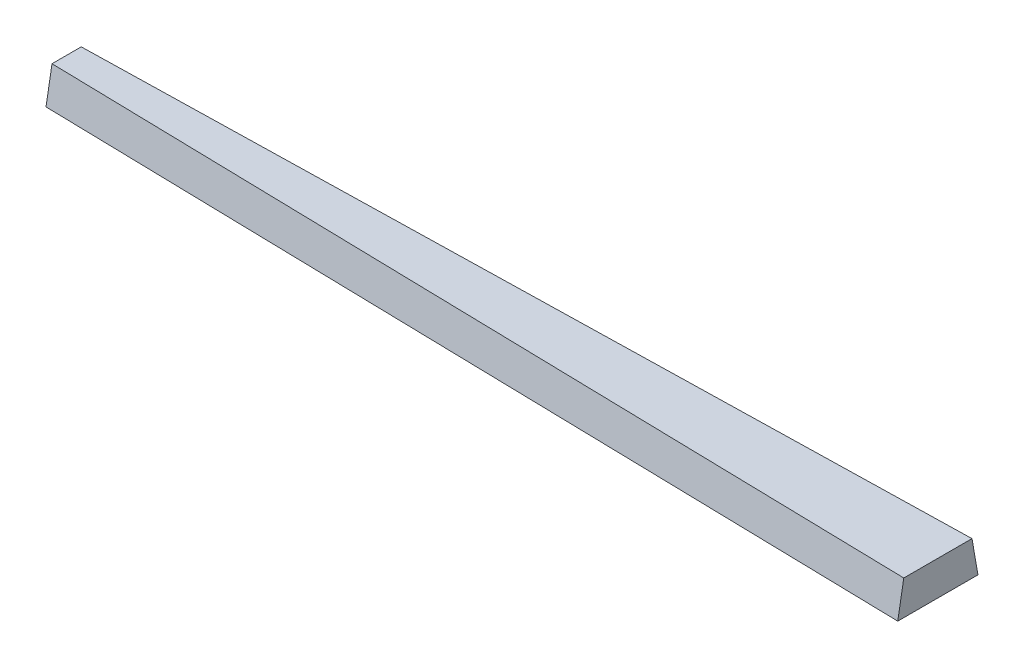
ISO-10303-21;
HEADER;
FILE_DESCRIPTION(('STEP AP214'),'2;1');
FILE_NAME('part.step','',(''),(''),'','','');
FILE_SCHEMA(('AUTOMOTIVE_DESIGN { 1 0 10303 214 1 1 1 1 }'));
ENDSEC;
DATA;
#1=APPLICATION_CONTEXT('core data for automotive mechanical design processes');
#2=APPLICATION_PROTOCOL_DEFINITION('international standard','automotive_design',2000,#1);
#3=PRODUCT_CONTEXT('',#1,'mechanical');
#4=PRODUCT('Part','Part','',(#3));
#5=PRODUCT_RELATED_PRODUCT_CATEGORY('part','',(#4));
#6=PRODUCT_DEFINITION_FORMATION('','',#4);
#7=PRODUCT_DEFINITION_CONTEXT('part definition',#1,'design');
#8=PRODUCT_DEFINITION('design','',#6,#7);
#9=PRODUCT_DEFINITION_SHAPE('','',#8);
#10=(LENGTH_UNIT() NAMED_UNIT(*) SI_UNIT(.MILLI.,.METRE.));
#11=(NAMED_UNIT(*) PLANE_ANGLE_UNIT() SI_UNIT($,.RADIAN.));
#12=(NAMED_UNIT(*) SI_UNIT($,.STERADIAN.) SOLID_ANGLE_UNIT());
#13=UNCERTAINTY_MEASURE_WITH_UNIT(LENGTH_MEASURE(1.E-05),#10,'distance_accuracy_value','');
#14=(GEOMETRIC_REPRESENTATION_CONTEXT(3) GLOBAL_UNCERTAINTY_ASSIGNED_CONTEXT((#13)) GLOBAL_UNIT_ASSIGNED_CONTEXT((#10,
#11,#12)) REPRESENTATION_CONTEXT('',''));
#15=CARTESIAN_POINT('',(0.,0.,0.));
#16=DIRECTION('',(0.,0.,1.));
#17=DIRECTION('',(1.,0.,0.));
#18=AXIS2_PLACEMENT_3D('',#15,#16,#17);
#19=CARTESIAN_POINT('',(241.3,19.05,25.4));
#20=DIRECTION('',(-1.,0.,0.));
#21=DIRECTION('',(0.,0.,1.));
#22=AXIS2_PLACEMENT_3D('',#19,#20,#21);
#23=PLANE('',#22);
#24=DIRECTION('',(0.,-0.985019169255836,-0.172444878725181));
#25=VECTOR('',#24,1.);
#26=CARTESIAN_POINT('',(241.3,26.5731601205701,-17.5729023379835));
#27=LINE('',#26,#25);
#28=CARTESIAN_POINT('',(241.3,19.05,-18.8899634420856));
#29=VERTEX_POINT('',#28);
#30=CARTESIAN_POINT('',(241.3,0.,-22.225));
#31=VERTEX_POINT('',#30);
#32=EDGE_CURVE('E47',#29,#31,#27,.T.);
#33=ORIENTED_EDGE('',*,*,#32,.F.);
#34=DIRECTION('',(0.,0.,-1.));
#35=VECTOR('',#34,1.);
#36=CARTESIAN_POINT('',(241.3,19.05,25.4));
#37=LINE('',#36,#35);
#38=CARTESIAN_POINT('',(241.3,19.05,18.8899634420856));
#39=VERTEX_POINT('',#38);
#40=EDGE_CURVE('E83',#39,#29,#37,.T.);
#41=ORIENTED_EDGE('',*,*,#40,.F.);
#42=DIRECTION('',(0.,0.985019169255836,-0.172444878725181));
#43=VECTOR('',#42,1.);
#44=CARTESIAN_POINT('',(241.3,17.9441953524076,19.0835539368694));
#45=LINE('',#44,#43);
#46=CARTESIAN_POINT('',(241.3,0.,22.225));
#47=VERTEX_POINT('',#46);
#48=EDGE_CURVE('E96',#47,#39,#45,.T.);
#49=ORIENTED_EDGE('',*,*,#48,.F.);
#50=DIRECTION('',(0.,0.,-1.));
#51=VECTOR('',#50,1.);
#52=CARTESIAN_POINT('',(241.3,0.,25.4));
#53=LINE('',#52,#51);
#54=EDGE_CURVE('E84',#47,#31,#53,.T.);
#55=ORIENTED_EDGE('',*,*,#54,.T.);
#56=EDGE_LOOP('',(#33,#41,#49,#55));
#57=FACE_BOUND('',#56,.T.);
#58=ADVANCED_FACE('F33',(#57),#23,.F.);
#59=CARTESIAN_POINT('',(-241.3,19.05,25.4));
#60=DIRECTION('',(1.,0.,0.));
#61=DIRECTION('',(0.,0.,-1.));
#62=AXIS2_PLACEMENT_3D('',#59,#60,#61);
#63=PLANE('',#62);
#64=DIRECTION('',(0.,0.985019169255836,0.172444878725181));
#65=VECTOR('',#64,1.);
#66=CARTESIAN_POINT('',(-241.3,24.7395051073356,-7.09891580274675));
#67=LINE('',#66,#65);
#68=CARTESIAN_POINT('',(-241.3,0.,-11.43));
#69=VERTEX_POINT('',#68);
#70=CARTESIAN_POINT('',(-241.3,19.05,-8.09496344208559));
#71=VERTEX_POINT('',#70);
#72=EDGE_CURVE('E72',#69,#71,#67,.T.);
#73=ORIENTED_EDGE('',*,*,#72,.F.);
#74=DIRECTION('',(0.,0.,1.));
#75=VECTOR('',#74,1.);
#76=CARTESIAN_POINT('',(-241.3,0.,25.4));
#77=LINE('',#76,#75);
#78=CARTESIAN_POINT('',(-241.3,0.,11.43));
#79=VERTEX_POINT('',#78);
#80=EDGE_CURVE('E54',#69,#79,#77,.T.);
#81=ORIENTED_EDGE('',*,*,#80,.T.);
#82=DIRECTION('',(0.,-0.985019169255836,0.172444878725181));
#83=VECTOR('',#82,1.);
#84=CARTESIAN_POINT('',(-241.3,16.1105403391731,8.6095674016327));
#85=LINE('',#84,#83);
#86=CARTESIAN_POINT('',(-241.3,19.05,8.09496344208559));
#87=VERTEX_POINT('',#86);
#88=EDGE_CURVE('E98',#87,#79,#85,.T.);
#89=ORIENTED_EDGE('',*,*,#88,.F.);
#90=DIRECTION('',(0.,0.,1.));
#91=VECTOR('',#90,1.);
#92=CARTESIAN_POINT('',(-241.3,19.05,25.4));
#93=LINE('',#92,#91);
#94=EDGE_CURVE('E79',#71,#87,#93,.T.);
#95=ORIENTED_EDGE('',*,*,#94,.F.);
#96=EDGE_LOOP('',(#73,#81,#89,#95));
#97=FACE_BOUND('',#96,.T.);
#98=ADVANCED_FACE('F78',(#97),#63,.F.);
#99=CARTESIAN_POINT('',(0.,19.05,0.));
#100=DIRECTION('',(0.,-1.,0.));
#101=DIRECTION('',(0.,0.,-1.));
#102=AXIS2_PLACEMENT_3D('',#99,#100,#101);
#103=PLANE('',#102);
#104=DIRECTION('',(0.999749920710572,0.,-0.0223628271737891));
#105=VECTOR('',#104,1.);
#106=CARTESIAN_POINT('',(-0.301654171773032,19.05,-13.4857159145591));
#107=LINE('',#106,#105);
#108=EDGE_CURVE('E100',#71,#29,#107,.T.);
#109=ORIENTED_EDGE('',*,*,#108,.F.);
#110=ORIENTED_EDGE('',*,*,#94,.T.);
#111=DIRECTION('',(-0.999749920710572,0.,-0.0223628271737891));
#112=VECTOR('',#111,1.);
#113=CARTESIAN_POINT('',(-0.301654171773032,19.05,13.4857159145591));
#114=LINE('',#113,#112);
#115=EDGE_CURVE('E88',#39,#87,#114,.T.);
#116=ORIENTED_EDGE('',*,*,#115,.F.);
#117=ORIENTED_EDGE('',*,*,#40,.T.);
#118=EDGE_LOOP('',(#109,#110,#116,#117));
#119=FACE_BOUND('',#118,.T.);
#120=ADVANCED_FACE('F105',(#119),#103,.F.);
#121=CARTESIAN_POINT('',(0.,0.,0.));
#122=DIRECTION('',(0.,-1.,0.));
#123=DIRECTION('',(0.,0.,-1.));
#124=AXIS2_PLACEMENT_3D('',#121,#122,#123);
#125=PLANE('',#124);
#126=ORIENTED_EDGE('',*,*,#80,.F.);
#127=DIRECTION('',(0.999749920710572,0.,-0.0223628271737891));
#128=VECTOR('',#127,1.);
#129=CARTESIAN_POINT('',(-0.376216366810928,0.,-16.8190846339003));
#130=LINE('',#129,#128);
#131=EDGE_CURVE('E11',#69,#31,#130,.T.);
#132=ORIENTED_EDGE('',*,*,#131,.T.);
#133=ORIENTED_EDGE('',*,*,#54,.F.);
#134=DIRECTION('',(-0.999749920710572,0.,-0.0223628271737891));
#135=VECTOR('',#134,1.);
#136=CARTESIAN_POINT('',(-0.376216366810928,0.,16.8190846339003));
#137=LINE('',#136,#135);
#138=EDGE_CURVE('E40',#47,#79,#137,.T.);
#139=ORIENTED_EDGE('',*,*,#138,.T.);
#140=EDGE_LOOP('',(#126,#132,#133,#139));
#141=FACE_BOUND('',#140,.T.);
#142=ADVANCED_FACE('F82',(#141),#125,.T.);
#143=CARTESIAN_POINT('',(-0.365034160445354,2.85695761982204,16.3191742316747));
#144=DIRECTION('',(-0.0220279772397924,0.172403035780846,0.984780158955425));
#145=DIRECTION('',(0.,-0.985019169255836,0.172444878725181));
#146=AXIS2_PLACEMENT_3D('',#143,#144,#145);
#147=PLANE('',#146);
#148=ORIENTED_EDGE('',*,*,#115,.T.);
#149=ORIENTED_EDGE('',*,*,#88,.T.);
#150=ORIENTED_EDGE('',*,*,#138,.F.);
#151=ORIENTED_EDGE('',*,*,#48,.T.);
#152=EDGE_LOOP('',(#148,#149,#150,#151));
#153=FACE_BOUND('',#152,.T.);
#154=ADVANCED_FACE('F107',(#153),#147,.T.);
#155=CARTESIAN_POINT('',(-0.365034160445354,2.85695761982204,-16.3191742316747));
#156=DIRECTION('',(-0.0220279772397924,0.172403035780846,-0.984780158955425));
#157=DIRECTION('',(0.,-0.985019169255836,-0.172444878725181));
#158=AXIS2_PLACEMENT_3D('',#155,#156,#157);
#159=PLANE('',#158);
#160=ORIENTED_EDGE('',*,*,#108,.T.);
#161=ORIENTED_EDGE('',*,*,#32,.T.);
#162=ORIENTED_EDGE('',*,*,#131,.F.);
#163=ORIENTED_EDGE('',*,*,#72,.T.);
#164=EDGE_LOOP('',(#160,#161,#162,#163));
#165=FACE_BOUND('',#164,.T.);
#166=ADVANCED_FACE('F71',(#165),#159,.T.);
#167=CLOSED_SHELL('',(#58,#98,#120,#142,#154,#166));
#168=MANIFOLD_SOLID_BREP('B2',#167);
#169=ADVANCED_BREP_SHAPE_REPRESENTATION('',(#18,#168),#14);
#170=SHAPE_DEFINITION_REPRESENTATION(#9,#169);
ENDSEC;
END-ISO-10303-21;
